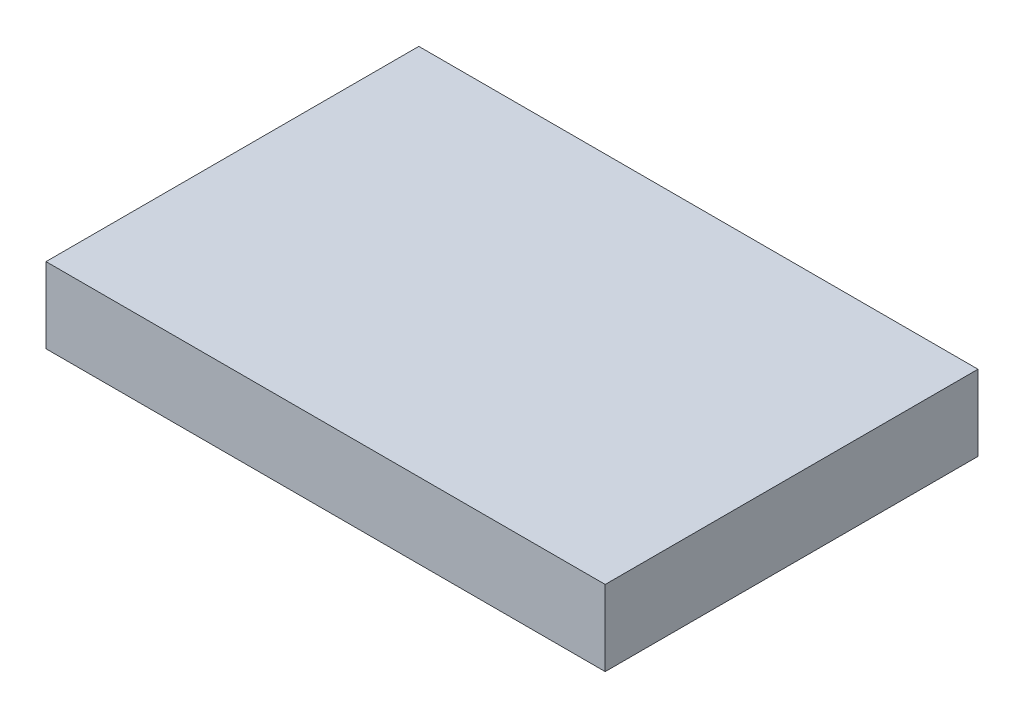
ISO-10303-21;
HEADER;
FILE_DESCRIPTION(('STEP AP214'),'2;1');
FILE_NAME('part.step','',(''),(''),'','','');
FILE_SCHEMA(('AUTOMOTIVE_DESIGN { 1 0 10303 214 1 1 1 1 }'));
ENDSEC;
DATA;
#1=APPLICATION_CONTEXT('core data for automotive mechanical design processes');
#2=APPLICATION_PROTOCOL_DEFINITION('international standard','automotive_design',2000,#1);
#3=PRODUCT_CONTEXT('',#1,'mechanical');
#4=PRODUCT('Part','Part','',(#3));
#5=PRODUCT_RELATED_PRODUCT_CATEGORY('part','',(#4));
#6=PRODUCT_DEFINITION_FORMATION('','',#4);
#7=PRODUCT_DEFINITION_CONTEXT('part definition',#1,'design');
#8=PRODUCT_DEFINITION('design','',#6,#7);
#9=PRODUCT_DEFINITION_SHAPE('','',#8);
#10=(LENGTH_UNIT() NAMED_UNIT(*) SI_UNIT(.MILLI.,.METRE.));
#11=(NAMED_UNIT(*) PLANE_ANGLE_UNIT() SI_UNIT($,.RADIAN.));
#12=(NAMED_UNIT(*) SI_UNIT($,.STERADIAN.) SOLID_ANGLE_UNIT());
#13=UNCERTAINTY_MEASURE_WITH_UNIT(LENGTH_MEASURE(1.E-05),#10,'distance_accuracy_value','');
#14=(GEOMETRIC_REPRESENTATION_CONTEXT(3) GLOBAL_UNCERTAINTY_ASSIGNED_CONTEXT((#13)) GLOBAL_UNIT_ASSIGNED_CONTEXT((#10,
#11,#12)) REPRESENTATION_CONTEXT('',''));
#15=CARTESIAN_POINT('',(0.,0.,0.));
#16=DIRECTION('',(0.,0.,1.));
#17=DIRECTION('',(1.,0.,0.));
#18=AXIS2_PLACEMENT_3D('',#15,#16,#17);
#19=CARTESIAN_POINT('',(0.,3.2,0.));
#20=DIRECTION('',(1.,0.,0.));
#21=DIRECTION('',(0.,0.,-1.));
#22=AXIS2_PLACEMENT_3D('',#19,#20,#21);
#23=PLANE('',#22);
#24=DIRECTION('',(0.,0.,1.));
#25=VECTOR('',#24,1.);
#26=CARTESIAN_POINT('',(0.,0.,0.));
#27=LINE('',#26,#25);
#28=CARTESIAN_POINT('',(0.,0.,-15.8));
#29=VERTEX_POINT('',#28);
#30=CARTESIAN_POINT('',(0.,0.,0.));
#31=VERTEX_POINT('',#30);
#32=EDGE_CURVE('E96',#29,#31,#27,.T.);
#33=ORIENTED_EDGE('',*,*,#32,.T.);
#34=DIRECTION('',(0.,-1.,0.));
#35=VECTOR('',#34,1.);
#36=CARTESIAN_POINT('',(0.,3.2,0.));
#37=LINE('',#36,#35);
#38=CARTESIAN_POINT('',(0.,3.2,0.));
#39=VERTEX_POINT('',#38);
#40=EDGE_CURVE('E11',#39,#31,#37,.T.);
#41=ORIENTED_EDGE('',*,*,#40,.F.);
#42=DIRECTION('',(0.,0.,1.));
#43=VECTOR('',#42,1.);
#44=CARTESIAN_POINT('',(0.,3.2,0.));
#45=LINE('',#44,#43);
#46=CARTESIAN_POINT('',(0.,3.2,-15.8));
#47=VERTEX_POINT('',#46);
#48=EDGE_CURVE('E84',#47,#39,#45,.T.);
#49=ORIENTED_EDGE('',*,*,#48,.F.);
#50=DIRECTION('',(0.,-1.,0.));
#51=VECTOR('',#50,1.);
#52=CARTESIAN_POINT('',(0.,3.2,-15.8));
#53=LINE('',#52,#51);
#54=EDGE_CURVE('E92',#47,#29,#53,.T.);
#55=ORIENTED_EDGE('',*,*,#54,.T.);
#56=EDGE_LOOP('',(#33,#41,#49,#55));
#57=FACE_BOUND('',#56,.T.);
#58=ADVANCED_FACE('F33',(#57),#23,.F.);
#59=CARTESIAN_POINT('',(0.,3.2,0.));
#60=DIRECTION('',(0.,0.,-1.));
#61=DIRECTION('',(-1.,0.,0.));
#62=AXIS2_PLACEMENT_3D('',#59,#60,#61);
#63=PLANE('',#62);
#64=DIRECTION('',(1.,0.,0.));
#65=VECTOR('',#64,1.);
#66=CARTESIAN_POINT('',(0.,0.,0.));
#67=LINE('',#66,#65);
#68=CARTESIAN_POINT('',(23.7,0.,0.));
#69=VERTEX_POINT('',#68);
#70=EDGE_CURVE('E88',#31,#69,#67,.T.);
#71=ORIENTED_EDGE('',*,*,#70,.T.);
#72=DIRECTION('',(0.,-1.,0.));
#73=VECTOR('',#72,1.);
#74=CARTESIAN_POINT('',(23.7,3.2,0.));
#75=LINE('',#74,#73);
#76=CARTESIAN_POINT('',(23.7,3.2,0.));
#77=VERTEX_POINT('',#76);
#78=EDGE_CURVE('E41',#77,#69,#75,.T.);
#79=ORIENTED_EDGE('',*,*,#78,.F.);
#80=DIRECTION('',(1.,0.,0.));
#81=VECTOR('',#80,1.);
#82=CARTESIAN_POINT('',(0.,3.2,0.));
#83=LINE('',#82,#81);
#84=EDGE_CURVE('E79',#39,#77,#83,.T.);
#85=ORIENTED_EDGE('',*,*,#84,.F.);
#86=ORIENTED_EDGE('',*,*,#40,.T.);
#87=EDGE_LOOP('',(#71,#79,#85,#86));
#88=FACE_BOUND('',#87,.T.);
#89=ADVANCED_FACE('F87',(#88),#63,.F.);
#90=CARTESIAN_POINT('',(23.7,3.2,0.));
#91=DIRECTION('',(-1.,0.,0.));
#92=DIRECTION('',(0.,0.,1.));
#93=AXIS2_PLACEMENT_3D('',#90,#91,#92);
#94=PLANE('',#93);
#95=DIRECTION('',(0.,0.,-1.));
#96=VECTOR('',#95,1.);
#97=CARTESIAN_POINT('',(23.7,0.,0.));
#98=LINE('',#97,#96);
#99=CARTESIAN_POINT('',(23.7,0.,-15.8));
#100=VERTEX_POINT('',#99);
#101=EDGE_CURVE('E66',#69,#100,#98,.T.);
#102=ORIENTED_EDGE('',*,*,#101,.T.);
#103=DIRECTION('',(0.,-1.,0.));
#104=VECTOR('',#103,1.);
#105=CARTESIAN_POINT('',(23.7,3.2,-15.8));
#106=LINE('',#105,#104);
#107=CARTESIAN_POINT('',(23.7,3.2,-15.8));
#108=VERTEX_POINT('',#107);
#109=EDGE_CURVE('E89',#108,#100,#106,.T.);
#110=ORIENTED_EDGE('',*,*,#109,.F.);
#111=DIRECTION('',(0.,0.,-1.));
#112=VECTOR('',#111,1.);
#113=CARTESIAN_POINT('',(23.7,3.2,0.));
#114=LINE('',#113,#112);
#115=EDGE_CURVE('E82',#77,#108,#114,.T.);
#116=ORIENTED_EDGE('',*,*,#115,.F.);
#117=ORIENTED_EDGE('',*,*,#78,.T.);
#118=EDGE_LOOP('',(#102,#110,#116,#117));
#119=FACE_BOUND('',#118,.T.);
#120=ADVANCED_FACE('F90',(#119),#94,.F.);
#121=CARTESIAN_POINT('',(0.,3.2,-15.8));
#122=DIRECTION('',(0.,0.,1.));
#123=DIRECTION('',(1.,0.,0.));
#124=AXIS2_PLACEMENT_3D('',#121,#122,#123);
#125=PLANE('',#124);
#126=DIRECTION('',(-1.,0.,0.));
#127=VECTOR('',#126,1.);
#128=CARTESIAN_POINT('',(0.,0.,-15.8));
#129=LINE('',#128,#127);
#130=EDGE_CURVE('E72',#100,#29,#129,.T.);
#131=ORIENTED_EDGE('',*,*,#130,.T.);
#132=ORIENTED_EDGE('',*,*,#54,.F.);
#133=DIRECTION('',(-1.,0.,0.));
#134=VECTOR('',#133,1.);
#135=CARTESIAN_POINT('',(0.,3.2,-15.8));
#136=LINE('',#135,#134);
#137=EDGE_CURVE('E49',#108,#47,#136,.T.);
#138=ORIENTED_EDGE('',*,*,#137,.F.);
#139=ORIENTED_EDGE('',*,*,#109,.T.);
#140=EDGE_LOOP('',(#131,#132,#138,#139));
#141=FACE_BOUND('',#140,.T.);
#142=ADVANCED_FACE('F103',(#141),#125,.F.);
#143=CARTESIAN_POINT('',(0.,3.2,0.));
#144=DIRECTION('',(0.,-1.,0.));
#145=DIRECTION('',(0.,0.,-1.));
#146=AXIS2_PLACEMENT_3D('',#143,#144,#145);
#147=PLANE('',#146);
#148=ORIENTED_EDGE('',*,*,#48,.T.);
#149=ORIENTED_EDGE('',*,*,#84,.T.);
#150=ORIENTED_EDGE('',*,*,#115,.T.);
#151=ORIENTED_EDGE('',*,*,#137,.T.);
#152=EDGE_LOOP('',(#148,#149,#150,#151));
#153=FACE_BOUND('',#152,.T.);
#154=ADVANCED_FACE('F80',(#153),#147,.F.);
#155=CARTESIAN_POINT('',(0.,0.,0.));
#156=DIRECTION('',(0.,-1.,0.));
#157=DIRECTION('',(0.,0.,-1.));
#158=AXIS2_PLACEMENT_3D('',#155,#156,#157);
#159=PLANE('',#158);
#160=ORIENTED_EDGE('',*,*,#32,.F.);
#161=ORIENTED_EDGE('',*,*,#130,.F.);
#162=ORIENTED_EDGE('',*,*,#101,.F.);
#163=ORIENTED_EDGE('',*,*,#70,.F.);
#164=EDGE_LOOP('',(#160,#161,#162,#163));
#165=FACE_BOUND('',#164,.T.);
#166=ADVANCED_FACE('F106',(#165),#159,.T.);
#167=CLOSED_SHELL('',(#58,#89,#120,#142,#154,#166));
#168=MANIFOLD_SOLID_BREP('B2',#167);
#169=ADVANCED_BREP_SHAPE_REPRESENTATION('',(#18,#168),#14);
#170=SHAPE_DEFINITION_REPRESENTATION(#9,#169);
ENDSEC;
END-ISO-10303-21;
